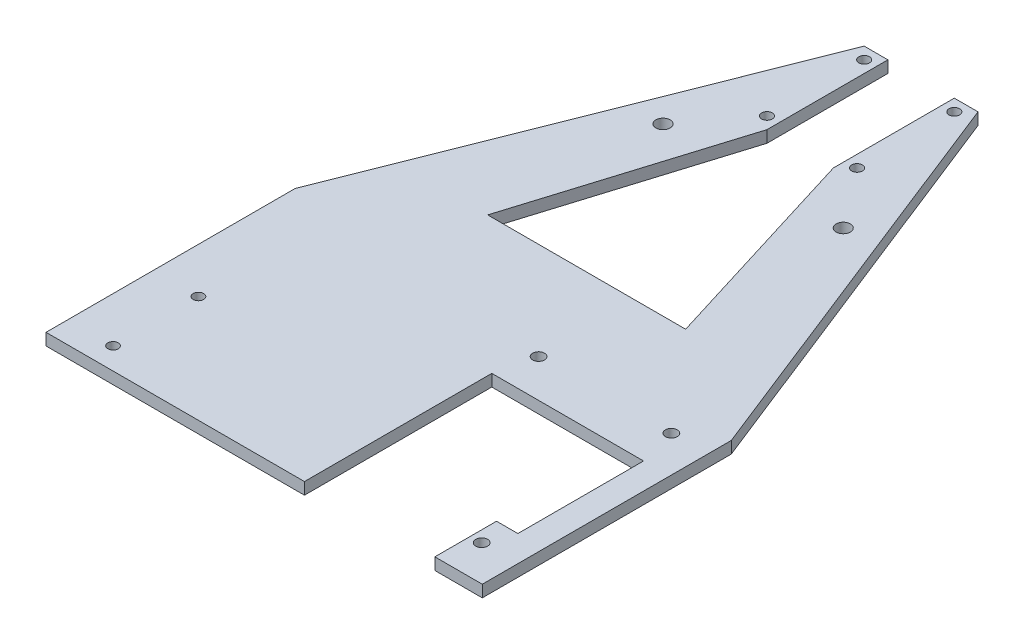
ISO-10303-21;
HEADER;
FILE_DESCRIPTION(('STEP AP214'),'2;1');
FILE_NAME('part.step','',(''),(''),'','','');
FILE_SCHEMA(('AUTOMOTIVE_DESIGN { 1 0 10303 214 1 1 1 1 }'));
ENDSEC;
DATA;
#1=APPLICATION_CONTEXT('core data for automotive mechanical design processes');
#2=APPLICATION_PROTOCOL_DEFINITION('international standard','automotive_design',2000,#1);
#3=PRODUCT_CONTEXT('',#1,'mechanical');
#4=PRODUCT('Part','Part','',(#3));
#5=PRODUCT_RELATED_PRODUCT_CATEGORY('part','',(#4));
#6=PRODUCT_DEFINITION_FORMATION('','',#4);
#7=PRODUCT_DEFINITION_CONTEXT('part definition',#1,'design');
#8=PRODUCT_DEFINITION('design','',#6,#7);
#9=PRODUCT_DEFINITION_SHAPE('','',#8);
#10=(LENGTH_UNIT() NAMED_UNIT(*) SI_UNIT(.MILLI.,.METRE.));
#11=(NAMED_UNIT(*) PLANE_ANGLE_UNIT() SI_UNIT($,.RADIAN.));
#12=(NAMED_UNIT(*) SI_UNIT($,.STERADIAN.) SOLID_ANGLE_UNIT());
#13=UNCERTAINTY_MEASURE_WITH_UNIT(LENGTH_MEASURE(1.E-05),#10,'distance_accuracy_value','');
#14=(GEOMETRIC_REPRESENTATION_CONTEXT(3) GLOBAL_UNCERTAINTY_ASSIGNED_CONTEXT((#13)) GLOBAL_UNIT_ASSIGNED_CONTEXT((#10,
#11,#12)) REPRESENTATION_CONTEXT('',''));
#15=CARTESIAN_POINT('',(0.,0.,0.));
#16=DIRECTION('',(0.,0.,1.));
#17=DIRECTION('',(1.,0.,0.));
#18=AXIS2_PLACEMENT_3D('',#15,#16,#17);
#19=CARTESIAN_POINT('',(0.,5.,0.));
#20=DIRECTION('',(0.,-1.,0.));
#21=DIRECTION('',(0.,0.,-1.));
#22=AXIS2_PLACEMENT_3D('',#19,#20,#21);
#23=PLANE('',#22);
#24=DIRECTION('',(-1.,0.,0.));
#25=VECTOR('',#24,1.);
#26=CARTESIAN_POINT('',(-23.722144460099,5.,-262.395827557433));
#27=LINE('',#26,#25);
#28=CARTESIAN_POINT('',(-13.722144460099,5.,-262.395827557433));
#29=VERTEX_POINT('',#28);
#30=CARTESIAN_POINT('',(-23.722144460099,5.,-262.395827557433));
#31=VERTEX_POINT('',#30);
#32=EDGE_CURVE('E262',#29,#31,#27,.T.);
#33=ORIENTED_EDGE('',*,*,#32,.T.);
#34=DIRECTION('',(-0.367567516948782,0.,0.929996838964578));
#35=VECTOR('',#34,1.);
#36=CARTESIAN_POINT('',(-91.722144460099,5.,-90.346388655563));
#37=LINE('',#36,#35);
#38=CARTESIAN_POINT('',(-91.722144460099,5.,-90.346388655563));
#39=VERTEX_POINT('',#38);
#40=EDGE_CURVE('E132',#31,#39,#37,.T.);
#41=ORIENTED_EDGE('',*,*,#40,.T.);
#42=DIRECTION('',(0.,0.,1.));
#43=VECTOR('',#42,1.);
#44=CARTESIAN_POINT('',(-91.722144460099,5.,4.65356125278762));
#45=LINE('',#44,#43);
#46=CARTESIAN_POINT('',(-91.722144460099,5.,14.6682759918103));
#47=VERTEX_POINT('',#46);
#48=EDGE_CURVE('E323',#39,#47,#45,.T.);
#49=ORIENTED_EDGE('',*,*,#48,.T.);
#50=DIRECTION('',(1.,0.,0.));
#51=VECTOR('',#50,1.);
#52=CARTESIAN_POINT('',(-91.722144460099,5.,14.6682759918103));
#53=LINE('',#52,#51);
#54=CARTESIAN_POINT('',(17.2777981132363,5.,14.6682759918103));
#55=VERTEX_POINT('',#54);
#56=EDGE_CURVE('E343',#47,#55,#53,.T.);
#57=ORIENTED_EDGE('',*,*,#56,.T.);
#58=DIRECTION('',(0.,0.,-1.));
#59=VECTOR('',#58,1.);
#60=CARTESIAN_POINT('',(17.2777981132363,5.,14.6682759918103));
#61=LINE('',#60,#59);
#62=CARTESIAN_POINT('',(17.2777981132363,5.,-64.3464311692135));
#63=VERTEX_POINT('',#62);
#64=EDGE_CURVE('E339',#55,#63,#61,.T.);
#65=ORIENTED_EDGE('',*,*,#64,.T.);
#66=DIRECTION('',(1.,0.,0.));
#67=VECTOR('',#66,1.);
#68=CARTESIAN_POINT('',(81.277855539901,5.,-64.3464311692136));
#69=LINE('',#68,#67);
#70=CARTESIAN_POINT('',(81.277855539901,5.,-64.3464311692136));
#71=VERTEX_POINT('',#70);
#72=EDGE_CURVE('E342',#63,#71,#69,.T.);
#73=ORIENTED_EDGE('',*,*,#72,.T.);
#74=DIRECTION('',(0.,0.,1.));
#75=VECTOR('',#74,1.);
#76=CARTESIAN_POINT('',(81.277855539901,5.,-11.3464311692136));
#77=LINE('',#76,#75);
#78=CARTESIAN_POINT('',(81.277855539901,5.,-11.3464311692136));
#79=VERTEX_POINT('',#78);
#80=EDGE_CURVE('E348',#71,#79,#77,.T.);
#81=ORIENTED_EDGE('',*,*,#80,.T.);
#82=DIRECTION('',(-1.,0.,0.));
#83=VECTOR('',#82,1.);
#84=CARTESIAN_POINT('',(72.277855539901,5.,-11.3464311692136));
#85=LINE('',#84,#83);
#86=CARTESIAN_POINT('',(72.277855539901,5.,-11.3464311692136));
#87=VERTEX_POINT('',#86);
#88=EDGE_CURVE('E355',#79,#87,#85,.T.);
#89=ORIENTED_EDGE('',*,*,#88,.T.);
#90=DIRECTION('',(0.,0.,1.));
#91=VECTOR('',#90,1.);
#92=CARTESIAN_POINT('',(72.277855539901,5.,4.65356125278764));
#93=LINE('',#92,#91);
#94=CARTESIAN_POINT('',(72.277855539901,5.,14.6682759918103));
#95=VERTEX_POINT('',#94);
#96=EDGE_CURVE('E358',#87,#95,#93,.T.);
#97=ORIENTED_EDGE('',*,*,#96,.T.);
#98=DIRECTION('',(1.,0.,0.));
#99=VECTOR('',#98,1.);
#100=CARTESIAN_POINT('',(72.277855539901,5.,14.6682759918103));
#101=LINE('',#100,#99);
#102=CARTESIAN_POINT('',(92.277855539901,5.,14.6682759918103));
#103=VERTEX_POINT('',#102);
#104=EDGE_CURVE('E361',#95,#103,#101,.T.);
#105=ORIENTED_EDGE('',*,*,#104,.T.);
#106=DIRECTION('',(0.,0.,-1.));
#107=VECTOR('',#106,1.);
#108=CARTESIAN_POINT('',(92.277855539901,5.,14.6682759918103));
#109=LINE('',#108,#107);
#110=CARTESIAN_POINT('',(92.277855539901,5.,-90.346388655563));
#111=VERTEX_POINT('',#110);
#112=EDGE_CURVE('E364',#103,#111,#109,.T.);
#113=ORIENTED_EDGE('',*,*,#112,.T.);
#114=DIRECTION('',(-0.367567516948782,0.,-0.929996838964578));
#115=VECTOR('',#114,1.);
#116=CARTESIAN_POINT('',(92.277855539901,5.,-90.346388655563));
#117=LINE('',#116,#115);
#118=CARTESIAN_POINT('',(24.277855539901,5.,-262.395827557433));
#119=VERTEX_POINT('',#118);
#120=EDGE_CURVE('E367',#111,#119,#117,.T.);
#121=ORIENTED_EDGE('',*,*,#120,.T.);
#122=DIRECTION('',(-1.,0.,0.));
#123=VECTOR('',#122,1.);
#124=CARTESIAN_POINT('',(24.277855539901,5.,-262.395827557433));
#125=LINE('',#124,#123);
#126=CARTESIAN_POINT('',(14.277855539901,5.,-262.395827557433));
#127=VERTEX_POINT('',#126);
#128=EDGE_CURVE('E370',#119,#127,#125,.T.);
#129=ORIENTED_EDGE('',*,*,#128,.T.);
#130=DIRECTION('',(0.,0.,1.));
#131=VECTOR('',#130,1.);
#132=CARTESIAN_POINT('',(14.277855539901,5.,-262.395827557433));
#133=LINE('',#132,#131);
#134=CARTESIAN_POINT('',(14.277855539901,5.,-211.395827557433));
#135=VERTEX_POINT('',#134);
#136=EDGE_CURVE('E373',#127,#135,#133,.T.);
#137=ORIENTED_EDGE('',*,*,#136,.T.);
#138=DIRECTION('',(0.29447539626302,0.,0.955659061065052));
#139=VECTOR('',#138,1.);
#140=CARTESIAN_POINT('',(42.0255435318713,5.,-121.346438747212));
#141=LINE('',#140,#139);
#142=CARTESIAN_POINT('',(42.0255435318713,5.,-121.346438747212));
#143=VERTEX_POINT('',#142);
#144=EDGE_CURVE('E181',#135,#143,#141,.T.);
#145=ORIENTED_EDGE('',*,*,#144,.T.);
#146=DIRECTION('',(-1.,0.,0.));
#147=VECTOR('',#146,1.);
#148=CARTESIAN_POINT('',(42.0255435318713,5.,-121.346438747212));
#149=LINE('',#148,#147);
#150=CARTESIAN_POINT('',(-41.4698324520693,5.,-121.346438747212));
#151=VERTEX_POINT('',#150);
#152=EDGE_CURVE('E175',#143,#151,#149,.T.);
#153=ORIENTED_EDGE('',*,*,#152,.T.);
#154=DIRECTION('',(0.29447539626302,0.,-0.955659061065052));
#155=VECTOR('',#154,1.);
#156=CARTESIAN_POINT('',(-41.4698324520693,5.,-121.346438747212));
#157=LINE('',#156,#155);
#158=CARTESIAN_POINT('',(-13.722144460099,5.,-211.395827557433));
#159=VERTEX_POINT('',#158);
#160=EDGE_CURVE('E179',#151,#159,#157,.T.);
#161=ORIENTED_EDGE('',*,*,#160,.T.);
#162=DIRECTION('',(0.,0.,-1.));
#163=VECTOR('',#162,1.);
#164=CARTESIAN_POINT('',(-13.722144460099,5.,-262.395827557433));
#165=LINE('',#164,#163);
#166=EDGE_CURVE('E59',#159,#29,#165,.T.);
#167=ORIENTED_EDGE('',*,*,#166,.T.);
#168=EDGE_LOOP('',(#33,#41,#49,#57,#65,#73,#81,#89,#97,#105,#113,#121,#129,#137,#145,#153,#161,#167));
#169=FACE_BOUND('',#168,.T.);
#170=CARTESIAN_POINT('',(77.0104143684007,5.,-0.346438747212362));
#171=DIRECTION('',(0.,1.,0.));
#172=DIRECTION('',(0.,0.,1.));
#173=AXIS2_PLACEMENT_3D('',#170,#171,#172);
#174=CIRCLE('',#173,2.50000000000001);
#175=CARTESIAN_POINT('',(77.0104143684007,5.,2.15356125278765));
#176=VERTEX_POINT('',#175);
#177=EDGE_CURVE('E209',#176,#176,#174,.T.);
#178=ORIENTED_EDGE('',*,*,#177,.F.);
#179=EDGE_LOOP('',(#178));
#180=FACE_BOUND('',#179,.T.);
#181=CARTESIAN_POINT('',(77.0104143684007,5.,-80.3464387472124));
#182=DIRECTION('',(0.,1.,0.));
#183=DIRECTION('',(0.,0.,1.));
#184=AXIS2_PLACEMENT_3D('',#181,#182,#183);
#185=CIRCLE('',#184,2.50000000000001);
#186=CARTESIAN_POINT('',(77.0104143684007,5.,-77.8464387472124));
#187=VERTEX_POINT('',#186);
#188=EDGE_CURVE('E806',#187,#187,#185,.T.);
#189=ORIENTED_EDGE('',*,*,#188,.F.);
#190=EDGE_LOOP('',(#189));
#191=FACE_BOUND('',#190,.T.);
#192=CARTESIAN_POINT('',(21.0104143684007,5.,-80.3464387472124));
#193=DIRECTION('',(0.,1.,0.));
#194=DIRECTION('',(0.,0.,1.));
#195=AXIS2_PLACEMENT_3D('',#192,#193,#194);
#196=CIRCLE('',#195,2.5);
#197=CARTESIAN_POINT('',(21.0104143684007,5.,-77.8464387472124));
#198=VERTEX_POINT('',#197);
#199=EDGE_CURVE('E814',#198,#198,#196,.T.);
#200=ORIENTED_EDGE('',*,*,#199,.F.);
#201=EDGE_LOOP('',(#200));
#202=FACE_BOUND('',#201,.T.);
#203=CARTESIAN_POINT('',(-72.6567145974466,5.,5.45064864502133));
#204=DIRECTION('',(0.,1.,0.));
#205=DIRECTION('',(0.,0.,1.));
#206=AXIS2_PLACEMENT_3D('',#203,#204,#205);
#207=CIRCLE('',#206,2.2);
#208=CARTESIAN_POINT('',(-72.6567145974466,5.,7.65064864502133));
#209=VERTEX_POINT('',#208);
#210=EDGE_CURVE('E822',#209,#209,#207,.T.);
#211=ORIENTED_EDGE('',*,*,#210,.F.);
#212=EDGE_LOOP('',(#211));
#213=FACE_BOUND('',#212,.T.);
#214=CARTESIAN_POINT('',(-18.722144460099,5.,-257.395827557432));
#215=DIRECTION('',(0.,1.,0.));
#216=DIRECTION('',(0.,0.,1.));
#217=AXIS2_PLACEMENT_3D('',#214,#215,#216);
#218=CIRCLE('',#217,2.25);
#219=CARTESIAN_POINT('',(-18.722144460099,5.,-255.145827557433));
#220=VERTEX_POINT('',#219);
#221=EDGE_CURVE('E830',#220,#220,#218,.T.);
#222=ORIENTED_EDGE('',*,*,#221,.F.);
#223=EDGE_LOOP('',(#222));
#224=FACE_BOUND('',#223,.T.);
#225=CARTESIAN_POINT('',(-18.722144460099,5.,-216.395827557433));
#226=DIRECTION('',(0.,1.,0.));
#227=DIRECTION('',(0.,0.,1.));
#228=AXIS2_PLACEMENT_3D('',#225,#226,#227);
#229=CIRCLE('',#228,2.25);
#230=CARTESIAN_POINT('',(-18.722144460099,5.,-214.145827557433));
#231=VERTEX_POINT('',#230);
#232=EDGE_CURVE('E838',#231,#231,#229,.T.);
#233=ORIENTED_EDGE('',*,*,#232,.F.);
#234=EDGE_LOOP('',(#233));
#235=FACE_BOUND('',#234,.T.);
#236=CARTESIAN_POINT('',(19.277855539901,5.,-257.395827557432));
#237=DIRECTION('',(0.,1.,0.));
#238=DIRECTION('',(0.,0.,1.));
#239=AXIS2_PLACEMENT_3D('',#236,#237,#238);
#240=CIRCLE('',#239,2.25);
#241=CARTESIAN_POINT('',(19.277855539901,5.,-255.145827557433));
#242=VERTEX_POINT('',#241);
#243=EDGE_CURVE('E846',#242,#242,#240,.T.);
#244=ORIENTED_EDGE('',*,*,#243,.F.);
#245=EDGE_LOOP('',(#244));
#246=FACE_BOUND('',#245,.T.);
#247=CARTESIAN_POINT('',(19.277855539901,5.,-216.395827557433));
#248=DIRECTION('',(0.,1.,0.));
#249=DIRECTION('',(0.,0.,1.));
#250=AXIS2_PLACEMENT_3D('',#247,#248,#249);
#251=CIRCLE('',#250,2.25);
#252=CARTESIAN_POINT('',(19.277855539901,5.,-214.145827557433));
#253=VERTEX_POINT('',#252);
#254=EDGE_CURVE('E854',#253,#253,#251,.T.);
#255=ORIENTED_EDGE('',*,*,#254,.F.);
#256=EDGE_LOOP('',(#255));
#257=FACE_BOUND('',#256,.T.);
#258=CARTESIAN_POINT('',(-37.722144460099,5.,-191.55194095078));
#259=DIRECTION('',(0.,1.,0.));
#260=DIRECTION('',(0.,0.,1.));
#261=AXIS2_PLACEMENT_3D('',#258,#259,#260);
#262=CIRCLE('',#261,3.);
#263=CARTESIAN_POINT('',(-37.722144460099,5.,-188.55194095078));
#264=VERTEX_POINT('',#263);
#265=EDGE_CURVE('E862',#264,#264,#262,.T.);
#266=ORIENTED_EDGE('',*,*,#265,.F.);
#267=EDGE_LOOP('',(#266));
#268=FACE_BOUND('',#267,.T.);
#269=CARTESIAN_POINT('',(38.277855539901,5.,-191.55194095078));
#270=DIRECTION('',(0.,1.,0.));
#271=DIRECTION('',(0.,0.,1.));
#272=AXIS2_PLACEMENT_3D('',#269,#270,#271);
#273=CIRCLE('',#272,3.);
#274=CARTESIAN_POINT('',(38.277855539901,5.,-188.55194095078));
#275=VERTEX_POINT('',#274);
#276=EDGE_CURVE('E870',#275,#275,#273,.T.);
#277=ORIENTED_EDGE('',*,*,#276,.F.);
#278=EDGE_LOOP('',(#277));
#279=FACE_BOUND('',#278,.T.);
#280=CARTESIAN_POINT('',(-72.6567145974466,5.,-30.5493513549787));
#281=DIRECTION('',(0.,1.,0.));
#282=DIRECTION('',(0.,0.,1.));
#283=AXIS2_PLACEMENT_3D('',#280,#281,#282);
#284=CIRCLE('',#283,2.2);
#285=CARTESIAN_POINT('',(-72.6567145974466,5.,-28.3493513549787));
#286=VERTEX_POINT('',#285);
#287=EDGE_CURVE('E878',#286,#286,#284,.T.);
#288=ORIENTED_EDGE('',*,*,#287,.F.);
#289=EDGE_LOOP('',(#288));
#290=FACE_BOUND('',#289,.T.);
#291=ADVANCED_FACE('F41',(#169,#180,#191,#202,#213,#224,#235,#246,#257,#268,#279,#290),#23,.F.);
#292=CARTESIAN_POINT('',(0.,0.,0.));
#293=DIRECTION('',(0.,-1.,0.));
#294=DIRECTION('',(0.,0.,-1.));
#295=AXIS2_PLACEMENT_3D('',#292,#293,#294);
#296=PLANE('',#295);
#297=CARTESIAN_POINT('',(38.277855539901,0.,-191.55194095078));
#298=DIRECTION('',(0.,1.,0.));
#299=DIRECTION('',(0.,0.,1.));
#300=AXIS2_PLACEMENT_3D('',#297,#298,#299);
#301=CIRCLE('',#300,3.);
#302=CARTESIAN_POINT('',(38.277855539901,0.,-188.55194095078));
#303=VERTEX_POINT('',#302);
#304=EDGE_CURVE('E874',#303,#303,#301,.T.);
#305=ORIENTED_EDGE('',*,*,#304,.T.);
#306=EDGE_LOOP('',(#305));
#307=FACE_BOUND('',#306,.T.);
#308=CARTESIAN_POINT('',(19.277855539901,0.,-216.395827557433));
#309=DIRECTION('',(0.,1.,0.));
#310=DIRECTION('',(0.,0.,1.));
#311=AXIS2_PLACEMENT_3D('',#308,#309,#310);
#312=CIRCLE('',#311,2.25);
#313=CARTESIAN_POINT('',(19.277855539901,0.,-214.145827557433));
#314=VERTEX_POINT('',#313);
#315=EDGE_CURVE('E858',#314,#314,#312,.T.);
#316=ORIENTED_EDGE('',*,*,#315,.T.);
#317=EDGE_LOOP('',(#316));
#318=FACE_BOUND('',#317,.T.);
#319=CARTESIAN_POINT('',(-18.722144460099,0.,-216.395827557433));
#320=DIRECTION('',(0.,1.,0.));
#321=DIRECTION('',(0.,0.,1.));
#322=AXIS2_PLACEMENT_3D('',#319,#320,#321);
#323=CIRCLE('',#322,2.25);
#324=CARTESIAN_POINT('',(-18.722144460099,0.,-214.145827557433));
#325=VERTEX_POINT('',#324);
#326=EDGE_CURVE('E842',#325,#325,#323,.T.);
#327=ORIENTED_EDGE('',*,*,#326,.T.);
#328=EDGE_LOOP('',(#327));
#329=FACE_BOUND('',#328,.T.);
#330=CARTESIAN_POINT('',(-72.6567145974466,0.,5.45064864502133));
#331=DIRECTION('',(0.,1.,0.));
#332=DIRECTION('',(0.,0.,1.));
#333=AXIS2_PLACEMENT_3D('',#330,#331,#332);
#334=CIRCLE('',#333,2.2);
#335=CARTESIAN_POINT('',(-72.6567145974466,0.,7.65064864502133));
#336=VERTEX_POINT('',#335);
#337=EDGE_CURVE('E826',#336,#336,#334,.T.);
#338=ORIENTED_EDGE('',*,*,#337,.T.);
#339=EDGE_LOOP('',(#338));
#340=FACE_BOUND('',#339,.T.);
#341=CARTESIAN_POINT('',(77.0104143684007,0.,-80.3464387472124));
#342=DIRECTION('',(0.,1.,0.));
#343=DIRECTION('',(0.,0.,1.));
#344=AXIS2_PLACEMENT_3D('',#341,#342,#343);
#345=CIRCLE('',#344,2.50000000000001);
#346=CARTESIAN_POINT('',(77.0104143684007,0.,-77.8464387472124));
#347=VERTEX_POINT('',#346);
#348=EDGE_CURVE('E810',#347,#347,#345,.T.);
#349=ORIENTED_EDGE('',*,*,#348,.T.);
#350=EDGE_LOOP('',(#349));
#351=FACE_BOUND('',#350,.T.);
#352=DIRECTION('',(-1.,0.,0.));
#353=VECTOR('',#352,1.);
#354=CARTESIAN_POINT('',(-23.722144460099,0.,-262.395827557433));
#355=LINE('',#354,#353);
#356=CARTESIAN_POINT('',(-13.722144460099,0.,-262.395827557433));
#357=VERTEX_POINT('',#356);
#358=CARTESIAN_POINT('',(-23.722144460099,0.,-262.395827557433));
#359=VERTEX_POINT('',#358);
#360=EDGE_CURVE('E204',#357,#359,#355,.T.);
#361=ORIENTED_EDGE('',*,*,#360,.F.);
#362=DIRECTION('',(0.,0.,-1.));
#363=VECTOR('',#362,1.);
#364=CARTESIAN_POINT('',(-13.722144460099,0.,-262.395827557433));
#365=LINE('',#364,#363);
#366=CARTESIAN_POINT('',(-13.722144460099,0.,-211.395827557433));
#367=VERTEX_POINT('',#366);
#368=EDGE_CURVE('E124',#367,#357,#365,.T.);
#369=ORIENTED_EDGE('',*,*,#368,.F.);
#370=DIRECTION('',(0.29447539626302,0.,-0.955659061065052));
#371=VECTOR('',#370,1.);
#372=CARTESIAN_POINT('',(-41.4698324520693,0.,-121.346438747212));
#373=LINE('',#372,#371);
#374=CARTESIAN_POINT('',(-41.4698324520693,0.,-121.346438747212));
#375=VERTEX_POINT('',#374);
#376=EDGE_CURVE('E118',#375,#367,#373,.T.);
#377=ORIENTED_EDGE('',*,*,#376,.F.);
#378=DIRECTION('',(-1.,0.,0.));
#379=VECTOR('',#378,1.);
#380=CARTESIAN_POINT('',(42.0255435318713,0.,-121.346438747212));
#381=LINE('',#380,#379);
#382=CARTESIAN_POINT('',(42.0255435318713,0.,-121.346438747212));
#383=VERTEX_POINT('',#382);
#384=EDGE_CURVE('E190',#383,#375,#381,.T.);
#385=ORIENTED_EDGE('',*,*,#384,.F.);
#386=DIRECTION('',(0.29447539626302,0.,0.955659061065052));
#387=VECTOR('',#386,1.);
#388=CARTESIAN_POINT('',(42.0255435318713,0.,-121.346438747212));
#389=LINE('',#388,#387);
#390=CARTESIAN_POINT('',(14.277855539901,0.,-211.395827557433));
#391=VERTEX_POINT('',#390);
#392=EDGE_CURVE('E253',#391,#383,#389,.T.);
#393=ORIENTED_EDGE('',*,*,#392,.F.);
#394=DIRECTION('',(0.,0.,1.));
#395=VECTOR('',#394,1.);
#396=CARTESIAN_POINT('',(14.277855539901,0.,-262.395827557433));
#397=LINE('',#396,#395);
#398=CARTESIAN_POINT('',(14.277855539901,0.,-262.395827557433));
#399=VERTEX_POINT('',#398);
#400=EDGE_CURVE('E250',#399,#391,#397,.T.);
#401=ORIENTED_EDGE('',*,*,#400,.F.);
#402=DIRECTION('',(-1.,0.,0.));
#403=VECTOR('',#402,1.);
#404=CARTESIAN_POINT('',(24.277855539901,0.,-262.395827557433));
#405=LINE('',#404,#403);
#406=CARTESIAN_POINT('',(24.277855539901,0.,-262.395827557433));
#407=VERTEX_POINT('',#406);
#408=EDGE_CURVE('E247',#407,#399,#405,.T.);
#409=ORIENTED_EDGE('',*,*,#408,.F.);
#410=DIRECTION('',(-0.367567516948782,0.,-0.929996838964578));
#411=VECTOR('',#410,1.);
#412=CARTESIAN_POINT('',(92.277855539901,0.,-90.346388655563));
#413=LINE('',#412,#411);
#414=CARTESIAN_POINT('',(92.277855539901,0.,-90.346388655563));
#415=VERTEX_POINT('',#414);
#416=EDGE_CURVE('E244',#415,#407,#413,.T.);
#417=ORIENTED_EDGE('',*,*,#416,.F.);
#418=DIRECTION('',(0.,0.,-1.));
#419=VECTOR('',#418,1.);
#420=CARTESIAN_POINT('',(92.277855539901,0.,4.65356125278764));
#421=LINE('',#420,#419);
#422=CARTESIAN_POINT('',(92.277855539901,0.,14.6682759918103));
#423=VERTEX_POINT('',#422);
#424=EDGE_CURVE('E241',#423,#415,#421,.T.);
#425=ORIENTED_EDGE('',*,*,#424,.F.);
#426=DIRECTION('',(1.,0.,0.));
#427=VECTOR('',#426,1.);
#428=CARTESIAN_POINT('',(72.277855539901,0.,14.6682759918103));
#429=LINE('',#428,#427);
#430=CARTESIAN_POINT('',(72.277855539901,0.,14.6682759918103));
#431=VERTEX_POINT('',#430);
#432=EDGE_CURVE('E237',#431,#423,#429,.T.);
#433=ORIENTED_EDGE('',*,*,#432,.F.);
#434=DIRECTION('',(0.,0.,1.));
#435=VECTOR('',#434,1.);
#436=CARTESIAN_POINT('',(72.277855539901,0.,10.4335612527876));
#437=LINE('',#436,#435);
#438=CARTESIAN_POINT('',(72.277855539901,0.,-11.3464311692136));
#439=VERTEX_POINT('',#438);
#440=EDGE_CURVE('E234',#439,#431,#437,.T.);
#441=ORIENTED_EDGE('',*,*,#440,.F.);
#442=DIRECTION('',(-1.,0.,0.));
#443=VECTOR('',#442,1.);
#444=CARTESIAN_POINT('',(72.277855539901,0.,-11.3464311692136));
#445=LINE('',#444,#443);
#446=CARTESIAN_POINT('',(81.277855539901,0.,-11.3464311692136));
#447=VERTEX_POINT('',#446);
#448=EDGE_CURVE('E230',#447,#439,#445,.T.);
#449=ORIENTED_EDGE('',*,*,#448,.F.);
#450=DIRECTION('',(0.,0.,1.));
#451=VECTOR('',#450,1.);
#452=CARTESIAN_POINT('',(81.277855539901,0.,-11.3464311692136));
#453=LINE('',#452,#451);
#454=CARTESIAN_POINT('',(81.277855539901,0.,-64.3464311692136));
#455=VERTEX_POINT('',#454);
#456=EDGE_CURVE('E227',#455,#447,#453,.T.);
#457=ORIENTED_EDGE('',*,*,#456,.F.);
#458=DIRECTION('',(1.,0.,0.));
#459=VECTOR('',#458,1.);
#460=CARTESIAN_POINT('',(81.277855539901,0.,-64.3464311692136));
#461=LINE('',#460,#459);
#462=CARTESIAN_POINT('',(17.2777981132363,0.,-64.3464311692135));
#463=VERTEX_POINT('',#462);
#464=EDGE_CURVE('E224',#463,#455,#461,.T.);
#465=ORIENTED_EDGE('',*,*,#464,.F.);
#466=DIRECTION('',(0.,0.,-1.));
#467=VECTOR('',#466,1.);
#468=CARTESIAN_POINT('',(17.2777981132363,0.,-64.3464311692135));
#469=LINE('',#468,#467);
#470=CARTESIAN_POINT('',(17.2777981132363,0.,14.6682759918103));
#471=VERTEX_POINT('',#470);
#472=EDGE_CURVE('E221',#471,#463,#469,.T.);
#473=ORIENTED_EDGE('',*,*,#472,.F.);
#474=DIRECTION('',(1.,0.,0.));
#475=VECTOR('',#474,1.);
#476=CARTESIAN_POINT('',(-91.4567145974466,0.,14.6682759918103));
#477=LINE('',#476,#475);
#478=CARTESIAN_POINT('',(-91.722144460099,0.,14.6682759918103));
#479=VERTEX_POINT('',#478);
#480=EDGE_CURVE('E217',#479,#471,#477,.T.);
#481=ORIENTED_EDGE('',*,*,#480,.F.);
#482=DIRECTION('',(0.,0.,1.));
#483=VECTOR('',#482,1.);
#484=CARTESIAN_POINT('',(-91.722144460099,0.,10.4335612527876));
#485=LINE('',#484,#483);
#486=CARTESIAN_POINT('',(-91.722144460099,0.,-90.346388655563));
#487=VERTEX_POINT('',#486);
#488=EDGE_CURVE('E213',#487,#479,#485,.T.);
#489=ORIENTED_EDGE('',*,*,#488,.F.);
#490=DIRECTION('',(-0.367567516948782,0.,0.929996838964578));
#491=VECTOR('',#490,1.);
#492=CARTESIAN_POINT('',(-91.722144460099,0.,-90.346388655563));
#493=LINE('',#492,#491);
#494=EDGE_CURVE('E208',#359,#487,#493,.T.);
#495=ORIENTED_EDGE('',*,*,#494,.F.);
#496=EDGE_LOOP('',(#361,#369,#377,#385,#393,#401,#409,#417,#425,#433,#441,#449,#457,#465,#473,
#481,#489,#495));
#497=FACE_BOUND('',#496,.T.);
#498=CARTESIAN_POINT('',(77.0104143684007,0.,-0.346438747212362));
#499=DIRECTION('',(0.,1.,0.));
#500=DIRECTION('',(0.,0.,1.));
#501=AXIS2_PLACEMENT_3D('',#498,#499,#500);
#502=CIRCLE('',#501,2.50000000000001);
#503=CARTESIAN_POINT('',(77.0104143684007,0.,2.15356125278765));
#504=VERTEX_POINT('',#503);
#505=EDGE_CURVE('E798',#504,#504,#502,.T.);
#506=ORIENTED_EDGE('',*,*,#505,.T.);
#507=EDGE_LOOP('',(#506));
#508=FACE_BOUND('',#507,.T.);
#509=CARTESIAN_POINT('',(21.0104143684007,0.,-80.3464387472124));
#510=DIRECTION('',(0.,1.,0.));
#511=DIRECTION('',(0.,0.,1.));
#512=AXIS2_PLACEMENT_3D('',#509,#510,#511);
#513=CIRCLE('',#512,2.5);
#514=CARTESIAN_POINT('',(21.0104143684007,0.,-77.8464387472124));
#515=VERTEX_POINT('',#514);
#516=EDGE_CURVE('E818',#515,#515,#513,.T.);
#517=ORIENTED_EDGE('',*,*,#516,.T.);
#518=EDGE_LOOP('',(#517));
#519=FACE_BOUND('',#518,.T.);
#520=CARTESIAN_POINT('',(-18.722144460099,0.,-257.395827557432));
#521=DIRECTION('',(0.,1.,0.));
#522=DIRECTION('',(0.,0.,1.));
#523=AXIS2_PLACEMENT_3D('',#520,#521,#522);
#524=CIRCLE('',#523,2.25);
#525=CARTESIAN_POINT('',(-18.722144460099,0.,-255.145827557433));
#526=VERTEX_POINT('',#525);
#527=EDGE_CURVE('E834',#526,#526,#524,.T.);
#528=ORIENTED_EDGE('',*,*,#527,.T.);
#529=EDGE_LOOP('',(#528));
#530=FACE_BOUND('',#529,.T.);
#531=CARTESIAN_POINT('',(19.277855539901,0.,-257.395827557432));
#532=DIRECTION('',(0.,1.,0.));
#533=DIRECTION('',(0.,0.,1.));
#534=AXIS2_PLACEMENT_3D('',#531,#532,#533);
#535=CIRCLE('',#534,2.25);
#536=CARTESIAN_POINT('',(19.277855539901,0.,-255.145827557433));
#537=VERTEX_POINT('',#536);
#538=EDGE_CURVE('E850',#537,#537,#535,.T.);
#539=ORIENTED_EDGE('',*,*,#538,.T.);
#540=EDGE_LOOP('',(#539));
#541=FACE_BOUND('',#540,.T.);
#542=CARTESIAN_POINT('',(-37.722144460099,0.,-191.55194095078));
#543=DIRECTION('',(0.,1.,0.));
#544=DIRECTION('',(0.,0.,1.));
#545=AXIS2_PLACEMENT_3D('',#542,#543,#544);
#546=CIRCLE('',#545,3.);
#547=CARTESIAN_POINT('',(-37.722144460099,0.,-188.55194095078));
#548=VERTEX_POINT('',#547);
#549=EDGE_CURVE('E866',#548,#548,#546,.T.);
#550=ORIENTED_EDGE('',*,*,#549,.T.);
#551=EDGE_LOOP('',(#550));
#552=FACE_BOUND('',#551,.T.);
#553=CARTESIAN_POINT('',(-72.6567145974466,0.,-30.5493513549787));
#554=DIRECTION('',(0.,1.,0.));
#555=DIRECTION('',(0.,0.,1.));
#556=AXIS2_PLACEMENT_3D('',#553,#554,#555);
#557=CIRCLE('',#556,2.2);
#558=CARTESIAN_POINT('',(-72.6567145974466,0.,-28.3493513549787));
#559=VERTEX_POINT('',#558);
#560=EDGE_CURVE('E882',#559,#559,#557,.T.);
#561=ORIENTED_EDGE('',*,*,#560,.T.);
#562=EDGE_LOOP('',(#561));
#563=FACE_BOUND('',#562,.T.);
#564=ADVANCED_FACE('F328',(#307,#318,#329,#340,#351,#497,#508,#519,#530,#541,#552,#563),#296,.T.);
#565=CARTESIAN_POINT('',(-23.722144460099,5.,-262.395827557433));
#566=DIRECTION('',(0.,0.,1.));
#567=DIRECTION('',(1.,0.,0.));
#568=AXIS2_PLACEMENT_3D('',#565,#566,#567);
#569=PLANE('',#568);
#570=ORIENTED_EDGE('',*,*,#360,.T.);
#571=DIRECTION('',(0.,-1.,0.));
#572=VECTOR('',#571,1.);
#573=CARTESIAN_POINT('',(-23.722144460099,5.,-262.395827557433));
#574=LINE('',#573,#572);
#575=EDGE_CURVE('E11',#31,#359,#574,.T.);
#576=ORIENTED_EDGE('',*,*,#575,.F.);
#577=ORIENTED_EDGE('',*,*,#32,.F.);
#578=DIRECTION('',(0.,-1.,0.));
#579=VECTOR('',#578,1.);
#580=CARTESIAN_POINT('',(-13.722144460099,5.,-262.395827557433));
#581=LINE('',#580,#579);
#582=EDGE_CURVE('E200',#29,#357,#581,.T.);
#583=ORIENTED_EDGE('',*,*,#582,.T.);
#584=EDGE_LOOP('',(#570,#576,#577,#583));
#585=FACE_BOUND('',#584,.T.);
#586=ADVANCED_FACE('F43',(#585),#569,.F.);
#587=CARTESIAN_POINT('',(-91.722144460099,5.,-90.346388655563));
#588=DIRECTION('',(0.929996838964578,0.,0.367567516948782));
#589=DIRECTION('',(0.367567516948782,0.,-0.929996838964578));
#590=AXIS2_PLACEMENT_3D('',#587,#588,#589);
#591=PLANE('',#590);
#592=ORIENTED_EDGE('',*,*,#494,.T.);
#593=DIRECTION('',(0.,-1.,0.));
#594=VECTOR('',#593,1.);
#595=CARTESIAN_POINT('',(-91.722144460099,5.,-90.346388655563));
#596=LINE('',#595,#594);
#597=EDGE_CURVE('E51',#39,#487,#596,.T.);
#598=ORIENTED_EDGE('',*,*,#597,.F.);
#599=ORIENTED_EDGE('',*,*,#40,.F.);
#600=ORIENTED_EDGE('',*,*,#575,.T.);
#601=EDGE_LOOP('',(#592,#598,#599,#600));
#602=FACE_BOUND('',#601,.T.);
#603=ADVANCED_FACE('F324',(#602),#591,.F.);
#604=CARTESIAN_POINT('',(-91.722144460099,5.,10.4335612527876));
#605=DIRECTION('',(1.,0.,0.));
#606=DIRECTION('',(0.,0.,-1.));
#607=AXIS2_PLACEMENT_3D('',#604,#605,#606);
#608=PLANE('',#607);
#609=ORIENTED_EDGE('',*,*,#488,.T.);
#610=DIRECTION('',(0.,-1.,0.));
#611=VECTOR('',#610,1.);
#612=CARTESIAN_POINT('',(-91.722144460099,5.,14.6682759918103));
#613=LINE('',#612,#611);
#614=EDGE_CURVE('E313',#47,#479,#613,.T.);
#615=ORIENTED_EDGE('',*,*,#614,.F.);
#616=ORIENTED_EDGE('',*,*,#48,.F.);
#617=ORIENTED_EDGE('',*,*,#597,.T.);
#618=EDGE_LOOP('',(#609,#615,#616,#617));
#619=FACE_BOUND('',#618,.T.);
#620=ADVANCED_FACE('F321',(#619),#608,.F.);
#621=CARTESIAN_POINT('',(-91.4567145974466,5.,14.6682759918103));
#622=DIRECTION('',(0.,0.,-1.));
#623=DIRECTION('',(-1.,0.,0.));
#624=AXIS2_PLACEMENT_3D('',#621,#622,#623);
#625=PLANE('',#624);
#626=ORIENTED_EDGE('',*,*,#480,.T.);
#627=DIRECTION('',(0.,-1.,0.));
#628=VECTOR('',#627,1.);
#629=CARTESIAN_POINT('',(17.2777981132363,5.,14.6682759918103));
#630=LINE('',#629,#628);
#631=EDGE_CURVE('E309',#55,#471,#630,.T.);
#632=ORIENTED_EDGE('',*,*,#631,.F.);
#633=ORIENTED_EDGE('',*,*,#56,.F.);
#634=ORIENTED_EDGE('',*,*,#614,.T.);
#635=EDGE_LOOP('',(#626,#632,#633,#634));
#636=FACE_BOUND('',#635,.T.);
#637=ADVANCED_FACE('F333',(#636),#625,.F.);
#638=CARTESIAN_POINT('',(17.2777981132363,5.,-64.3464311692135));
#639=DIRECTION('',(-1.,0.,0.));
#640=DIRECTION('',(0.,0.,1.));
#641=AXIS2_PLACEMENT_3D('',#638,#639,#640);
#642=PLANE('',#641);
#643=ORIENTED_EDGE('',*,*,#472,.T.);
#644=DIRECTION('',(0.,-1.,0.));
#645=VECTOR('',#644,1.);
#646=CARTESIAN_POINT('',(17.2777981132363,5.,-64.3464311692135));
#647=LINE('',#646,#645);
#648=EDGE_CURVE('E305',#63,#463,#647,.T.);
#649=ORIENTED_EDGE('',*,*,#648,.F.);
#650=ORIENTED_EDGE('',*,*,#64,.F.);
#651=ORIENTED_EDGE('',*,*,#631,.T.);
#652=EDGE_LOOP('',(#643,#649,#650,#651));
#653=FACE_BOUND('',#652,.T.);
#654=ADVANCED_FACE('F337',(#653),#642,.F.);
#655=CARTESIAN_POINT('',(81.277855539901,5.,-64.3464311692136));
#656=DIRECTION('',(0.,0.,-1.));
#657=DIRECTION('',(-1.,0.,0.));
#658=AXIS2_PLACEMENT_3D('',#655,#656,#657);
#659=PLANE('',#658);
#660=ORIENTED_EDGE('',*,*,#464,.T.);
#661=DIRECTION('',(0.,-1.,0.));
#662=VECTOR('',#661,1.);
#663=CARTESIAN_POINT('',(81.277855539901,5.,-64.3464311692136));
#664=LINE('',#663,#662);
#665=EDGE_CURVE('E301',#71,#455,#664,.T.);
#666=ORIENTED_EDGE('',*,*,#665,.F.);
#667=ORIENTED_EDGE('',*,*,#72,.F.);
#668=ORIENTED_EDGE('',*,*,#648,.T.);
#669=EDGE_LOOP('',(#660,#666,#667,#668));
#670=FACE_BOUND('',#669,.T.);
#671=ADVANCED_FACE('F430',(#670),#659,.F.);
#672=CARTESIAN_POINT('',(81.277855539901,5.,-11.3464311692136));
#673=DIRECTION('',(1.,0.,0.));
#674=DIRECTION('',(0.,0.,-1.));
#675=AXIS2_PLACEMENT_3D('',#672,#673,#674);
#676=PLANE('',#675);
#677=ORIENTED_EDGE('',*,*,#456,.T.);
#678=DIRECTION('',(0.,-1.,0.));
#679=VECTOR('',#678,1.);
#680=CARTESIAN_POINT('',(81.277855539901,5.,-11.3464311692136));
#681=LINE('',#680,#679);
#682=EDGE_CURVE('E297',#79,#447,#681,.T.);
#683=ORIENTED_EDGE('',*,*,#682,.F.);
#684=ORIENTED_EDGE('',*,*,#80,.F.);
#685=ORIENTED_EDGE('',*,*,#665,.T.);
#686=EDGE_LOOP('',(#677,#683,#684,#685));
#687=FACE_BOUND('',#686,.T.);
#688=ADVANCED_FACE('F427',(#687),#676,.F.);
#689=CARTESIAN_POINT('',(72.277855539901,5.,-11.3464311692136));
#690=DIRECTION('',(0.,0.,1.));
#691=DIRECTION('',(1.,0.,0.));
#692=AXIS2_PLACEMENT_3D('',#689,#690,#691);
#693=PLANE('',#692);
#694=ORIENTED_EDGE('',*,*,#448,.T.);
#695=DIRECTION('',(0.,-1.,0.));
#696=VECTOR('',#695,1.);
#697=CARTESIAN_POINT('',(72.277855539901,5.,-11.3464311692136));
#698=LINE('',#697,#696);
#699=EDGE_CURVE('E293',#87,#439,#698,.T.);
#700=ORIENTED_EDGE('',*,*,#699,.F.);
#701=ORIENTED_EDGE('',*,*,#88,.F.);
#702=ORIENTED_EDGE('',*,*,#682,.T.);
#703=EDGE_LOOP('',(#694,#700,#701,#702));
#704=FACE_BOUND('',#703,.T.);
#705=ADVANCED_FACE('F422',(#704),#693,.F.);
#706=CARTESIAN_POINT('',(72.277855539901,5.,10.4335612527876));
#707=DIRECTION('',(1.,0.,0.));
#708=DIRECTION('',(0.,0.,-1.));
#709=AXIS2_PLACEMENT_3D('',#706,#707,#708);
#710=PLANE('',#709);
#711=ORIENTED_EDGE('',*,*,#440,.T.);
#712=DIRECTION('',(0.,-1.,0.));
#713=VECTOR('',#712,1.);
#714=CARTESIAN_POINT('',(72.277855539901,5.,14.6682759918103));
#715=LINE('',#714,#713);
#716=EDGE_CURVE('E289',#95,#431,#715,.T.);
#717=ORIENTED_EDGE('',*,*,#716,.F.);
#718=ORIENTED_EDGE('',*,*,#96,.F.);
#719=ORIENTED_EDGE('',*,*,#699,.T.);
#720=EDGE_LOOP('',(#711,#717,#718,#719));
#721=FACE_BOUND('',#720,.T.);
#722=ADVANCED_FACE('F417',(#721),#710,.F.);
#723=CARTESIAN_POINT('',(72.277855539901,5.,14.6682759918103));
#724=DIRECTION('',(0.,0.,-1.));
#725=DIRECTION('',(-1.,0.,0.));
#726=AXIS2_PLACEMENT_3D('',#723,#724,#725);
#727=PLANE('',#726);
#728=ORIENTED_EDGE('',*,*,#432,.T.);
#729=DIRECTION('',(0.,-1.,0.));
#730=VECTOR('',#729,1.);
#731=CARTESIAN_POINT('',(92.277855539901,5.,14.6682759918103));
#732=LINE('',#731,#730);
#733=EDGE_CURVE('E285',#103,#423,#732,.T.);
#734=ORIENTED_EDGE('',*,*,#733,.F.);
#735=ORIENTED_EDGE('',*,*,#104,.F.);
#736=ORIENTED_EDGE('',*,*,#716,.T.);
#737=EDGE_LOOP('',(#728,#734,#735,#736));
#738=FACE_BOUND('',#737,.T.);
#739=ADVANCED_FACE('F412',(#738),#727,.F.);
#740=CARTESIAN_POINT('',(92.277855539901,5.,4.65356125278764));
#741=DIRECTION('',(-1.,0.,0.));
#742=DIRECTION('',(0.,0.,1.));
#743=AXIS2_PLACEMENT_3D('',#740,#741,#742);
#744=PLANE('',#743);
#745=ORIENTED_EDGE('',*,*,#424,.T.);
#746=DIRECTION('',(0.,-1.,0.));
#747=VECTOR('',#746,1.);
#748=CARTESIAN_POINT('',(92.277855539901,5.,-90.346388655563));
#749=LINE('',#748,#747);
#750=EDGE_CURVE('E281',#111,#415,#749,.T.);
#751=ORIENTED_EDGE('',*,*,#750,.F.);
#752=ORIENTED_EDGE('',*,*,#112,.F.);
#753=ORIENTED_EDGE('',*,*,#733,.T.);
#754=EDGE_LOOP('',(#745,#751,#752,#753));
#755=FACE_BOUND('',#754,.T.);
#756=ADVANCED_FACE('F408',(#755),#744,.F.);
#757=CARTESIAN_POINT('',(92.277855539901,5.,-90.346388655563));
#758=DIRECTION('',(-0.929996838964578,0.,0.367567516948782));
#759=DIRECTION('',(0.367567516948782,0.,0.929996838964578));
#760=AXIS2_PLACEMENT_3D('',#757,#758,#759);
#761=PLANE('',#760);
#762=ORIENTED_EDGE('',*,*,#416,.T.);
#763=DIRECTION('',(0.,-1.,0.));
#764=VECTOR('',#763,1.);
#765=CARTESIAN_POINT('',(24.277855539901,5.,-262.395827557433));
#766=LINE('',#765,#764);
#767=EDGE_CURVE('E277',#119,#407,#766,.T.);
#768=ORIENTED_EDGE('',*,*,#767,.F.);
#769=ORIENTED_EDGE('',*,*,#120,.F.);
#770=ORIENTED_EDGE('',*,*,#750,.T.);
#771=EDGE_LOOP('',(#762,#768,#769,#770));
#772=FACE_BOUND('',#771,.T.);
#773=ADVANCED_FACE('F404',(#772),#761,.F.);
#774=CARTESIAN_POINT('',(24.277855539901,5.,-262.395827557433));
#775=DIRECTION('',(0.,0.,1.));
#776=DIRECTION('',(1.,0.,0.));
#777=AXIS2_PLACEMENT_3D('',#774,#775,#776);
#778=PLANE('',#777);
#779=ORIENTED_EDGE('',*,*,#408,.T.);
#780=DIRECTION('',(0.,-1.,0.));
#781=VECTOR('',#780,1.);
#782=CARTESIAN_POINT('',(14.277855539901,5.,-262.395827557433));
#783=LINE('',#782,#781);
#784=EDGE_CURVE('E273',#127,#399,#783,.T.);
#785=ORIENTED_EDGE('',*,*,#784,.F.);
#786=ORIENTED_EDGE('',*,*,#128,.F.);
#787=ORIENTED_EDGE('',*,*,#767,.T.);
#788=EDGE_LOOP('',(#779,#785,#786,#787));
#789=FACE_BOUND('',#788,.T.);
#790=ADVANCED_FACE('F400',(#789),#778,.F.);
#791=CARTESIAN_POINT('',(14.277855539901,5.,-262.395827557433));
#792=DIRECTION('',(1.,0.,0.));
#793=DIRECTION('',(0.,0.,-1.));
#794=AXIS2_PLACEMENT_3D('',#791,#792,#793);
#795=PLANE('',#794);
#796=ORIENTED_EDGE('',*,*,#400,.T.);
#797=DIRECTION('',(0.,-1.,0.));
#798=VECTOR('',#797,1.);
#799=CARTESIAN_POINT('',(14.277855539901,5.,-211.395827557433));
#800=LINE('',#799,#798);
#801=EDGE_CURVE('E269',#135,#391,#800,.T.);
#802=ORIENTED_EDGE('',*,*,#801,.F.);
#803=ORIENTED_EDGE('',*,*,#136,.F.);
#804=ORIENTED_EDGE('',*,*,#784,.T.);
#805=EDGE_LOOP('',(#796,#802,#803,#804));
#806=FACE_BOUND('',#805,.T.);
#807=ADVANCED_FACE('F392',(#806),#795,.F.);
#808=CARTESIAN_POINT('',(42.0255435318713,5.,-121.346438747212));
#809=DIRECTION('',(0.955659061065052,0.,-0.29447539626302));
#810=DIRECTION('',(-0.29447539626302,0.,-0.955659061065052));
#811=AXIS2_PLACEMENT_3D('',#808,#809,#810);
#812=PLANE('',#811);
#813=ORIENTED_EDGE('',*,*,#392,.T.);
#814=DIRECTION('',(0.,-1.,0.));
#815=VECTOR('',#814,1.);
#816=CARTESIAN_POINT('',(42.0255435318713,5.,-121.346438747212));
#817=LINE('',#816,#815);
#818=EDGE_CURVE('E192',#143,#383,#817,.T.);
#819=ORIENTED_EDGE('',*,*,#818,.F.);
#820=ORIENTED_EDGE('',*,*,#144,.F.);
#821=ORIENTED_EDGE('',*,*,#801,.T.);
#822=EDGE_LOOP('',(#813,#819,#820,#821));
#823=FACE_BOUND('',#822,.T.);
#824=ADVANCED_FACE('F396',(#823),#812,.F.);
#825=CARTESIAN_POINT('',(42.0255435318713,5.,-121.346438747212));
#826=DIRECTION('',(0.,0.,1.));
#827=DIRECTION('',(1.,0.,0.));
#828=AXIS2_PLACEMENT_3D('',#825,#826,#827);
#829=PLANE('',#828);
#830=ORIENTED_EDGE('',*,*,#384,.T.);
#831=DIRECTION('',(0.,-1.,0.));
#832=VECTOR('',#831,1.);
#833=CARTESIAN_POINT('',(-41.4698324520693,5.,-121.346438747212));
#834=LINE('',#833,#832);
#835=EDGE_CURVE('E187',#151,#375,#834,.T.);
#836=ORIENTED_EDGE('',*,*,#835,.F.);
#837=ORIENTED_EDGE('',*,*,#152,.F.);
#838=ORIENTED_EDGE('',*,*,#818,.T.);
#839=EDGE_LOOP('',(#830,#836,#837,#838));
#840=FACE_BOUND('',#839,.T.);
#841=ADVANCED_FACE('F188',(#840),#829,.F.);
#842=CARTESIAN_POINT('',(-41.4698324520693,5.,-121.346438747212));
#843=DIRECTION('',(-0.955659061065052,0.,-0.29447539626302));
#844=DIRECTION('',(-0.29447539626302,0.,0.955659061065052));
#845=AXIS2_PLACEMENT_3D('',#842,#843,#844);
#846=PLANE('',#845);
#847=ORIENTED_EDGE('',*,*,#376,.T.);
#848=DIRECTION('',(0.,-1.,0.));
#849=VECTOR('',#848,1.);
#850=CARTESIAN_POINT('',(-13.722144460099,5.,-211.395827557433));
#851=LINE('',#850,#849);
#852=EDGE_CURVE('E193',#159,#367,#851,.T.);
#853=ORIENTED_EDGE('',*,*,#852,.F.);
#854=ORIENTED_EDGE('',*,*,#160,.F.);
#855=ORIENTED_EDGE('',*,*,#835,.T.);
#856=EDGE_LOOP('',(#847,#853,#854,#855));
#857=FACE_BOUND('',#856,.T.);
#858=ADVANCED_FACE('F195',(#857),#846,.F.);
#859=CARTESIAN_POINT('',(-13.722144460099,5.,-262.395827557433));
#860=DIRECTION('',(-1.,0.,0.));
#861=DIRECTION('',(0.,0.,1.));
#862=AXIS2_PLACEMENT_3D('',#859,#860,#861);
#863=PLANE('',#862);
#864=ORIENTED_EDGE('',*,*,#368,.T.);
#865=ORIENTED_EDGE('',*,*,#582,.F.);
#866=ORIENTED_EDGE('',*,*,#166,.F.);
#867=ORIENTED_EDGE('',*,*,#852,.T.);
#868=EDGE_LOOP('',(#864,#865,#866,#867));
#869=FACE_BOUND('',#868,.T.);
#870=ADVANCED_FACE('F450',(#869),#863,.F.);
#871=CARTESIAN_POINT('',(77.0104143684007,5.,-0.346438747212362));
#872=DIRECTION('',(0.,-1.,0.));
#873=DIRECTION('',(0.,0.,-1.));
#874=AXIS2_PLACEMENT_3D('',#871,#872,#873);
#875=CYLINDRICAL_SURFACE('',#874,2.50000000000001);
#876=ORIENTED_EDGE('',*,*,#177,.T.);
#877=EDGE_LOOP('',(#876));
#878=FACE_BOUND('',#877,.T.);
#879=ORIENTED_EDGE('',*,*,#505,.F.);
#880=EDGE_LOOP('',(#879));
#881=FACE_BOUND('',#880,.T.);
#882=ADVANCED_FACE('F447',(#878,#881),#875,.F.);
#883=CARTESIAN_POINT('',(77.0104143684007,5.,-80.3464387472124));
#884=DIRECTION('',(0.,-1.,0.));
#885=DIRECTION('',(0.,0.,-1.));
#886=AXIS2_PLACEMENT_3D('',#883,#884,#885);
#887=CYLINDRICAL_SURFACE('',#886,2.50000000000001);
#888=ORIENTED_EDGE('',*,*,#188,.T.);
#889=EDGE_LOOP('',(#888));
#890=FACE_BOUND('',#889,.T.);
#891=ORIENTED_EDGE('',*,*,#348,.F.);
#892=EDGE_LOOP('',(#891));
#893=FACE_BOUND('',#892,.T.);
#894=ADVANCED_FACE('F522',(#890,#893),#887,.F.);
#895=CARTESIAN_POINT('',(21.0104143684007,5.,-80.3464387472124));
#896=DIRECTION('',(0.,-1.,0.));
#897=DIRECTION('',(0.,0.,-1.));
#898=AXIS2_PLACEMENT_3D('',#895,#896,#897);
#899=CYLINDRICAL_SURFACE('',#898,2.5);
#900=ORIENTED_EDGE('',*,*,#199,.T.);
#901=EDGE_LOOP('',(#900));
#902=FACE_BOUND('',#901,.T.);
#903=ORIENTED_EDGE('',*,*,#516,.F.);
#904=EDGE_LOOP('',(#903));
#905=FACE_BOUND('',#904,.T.);
#906=ADVANCED_FACE('F529',(#902,#905),#899,.F.);
#907=CARTESIAN_POINT('',(-72.6567145974466,5.,5.45064864502133));
#908=DIRECTION('',(0.,-1.,0.));
#909=DIRECTION('',(0.,0.,-1.));
#910=AXIS2_PLACEMENT_3D('',#907,#908,#909);
#911=CYLINDRICAL_SURFACE('',#910,2.2);
#912=ORIENTED_EDGE('',*,*,#210,.T.);
#913=EDGE_LOOP('',(#912));
#914=FACE_BOUND('',#913,.T.);
#915=ORIENTED_EDGE('',*,*,#337,.F.);
#916=EDGE_LOOP('',(#915));
#917=FACE_BOUND('',#916,.T.);
#918=ADVANCED_FACE('F536',(#914,#917),#911,.F.);
#919=CARTESIAN_POINT('',(-18.722144460099,5.,-257.395827557432));
#920=DIRECTION('',(0.,-1.,0.));
#921=DIRECTION('',(0.,0.,-1.));
#922=AXIS2_PLACEMENT_3D('',#919,#920,#921);
#923=CYLINDRICAL_SURFACE('',#922,2.25);
#924=ORIENTED_EDGE('',*,*,#221,.T.);
#925=EDGE_LOOP('',(#924));
#926=FACE_BOUND('',#925,.T.);
#927=ORIENTED_EDGE('',*,*,#527,.F.);
#928=EDGE_LOOP('',(#927));
#929=FACE_BOUND('',#928,.T.);
#930=ADVANCED_FACE('F544',(#926,#929),#923,.F.);
#931=CARTESIAN_POINT('',(-18.722144460099,5.,-216.395827557433));
#932=DIRECTION('',(0.,-1.,0.));
#933=DIRECTION('',(0.,0.,-1.));
#934=AXIS2_PLACEMENT_3D('',#931,#932,#933);
#935=CYLINDRICAL_SURFACE('',#934,2.25);
#936=ORIENTED_EDGE('',*,*,#232,.T.);
#937=EDGE_LOOP('',(#936));
#938=FACE_BOUND('',#937,.T.);
#939=ORIENTED_EDGE('',*,*,#326,.F.);
#940=EDGE_LOOP('',(#939));
#941=FACE_BOUND('',#940,.T.);
#942=ADVANCED_FACE('F552',(#938,#941),#935,.F.);
#943=CARTESIAN_POINT('',(19.277855539901,5.,-257.395827557432));
#944=DIRECTION('',(0.,-1.,0.));
#945=DIRECTION('',(0.,0.,-1.));
#946=AXIS2_PLACEMENT_3D('',#943,#944,#945);
#947=CYLINDRICAL_SURFACE('',#946,2.25);
#948=ORIENTED_EDGE('',*,*,#243,.T.);
#949=EDGE_LOOP('',(#948));
#950=FACE_BOUND('',#949,.T.);
#951=ORIENTED_EDGE('',*,*,#538,.F.);
#952=EDGE_LOOP('',(#951));
#953=FACE_BOUND('',#952,.T.);
#954=ADVANCED_FACE('F560',(#950,#953),#947,.F.);
#955=CARTESIAN_POINT('',(19.277855539901,5.,-216.395827557433));
#956=DIRECTION('',(0.,-1.,0.));
#957=DIRECTION('',(0.,0.,-1.));
#958=AXIS2_PLACEMENT_3D('',#955,#956,#957);
#959=CYLINDRICAL_SURFACE('',#958,2.25);
#960=ORIENTED_EDGE('',*,*,#254,.T.);
#961=EDGE_LOOP('',(#960));
#962=FACE_BOUND('',#961,.T.);
#963=ORIENTED_EDGE('',*,*,#315,.F.);
#964=EDGE_LOOP('',(#963));
#965=FACE_BOUND('',#964,.T.);
#966=ADVANCED_FACE('F568',(#962,#965),#959,.F.);
#967=CARTESIAN_POINT('',(-37.722144460099,5.,-191.55194095078));
#968=DIRECTION('',(0.,-1.,0.));
#969=DIRECTION('',(0.,0.,-1.));
#970=AXIS2_PLACEMENT_3D('',#967,#968,#969);
#971=CYLINDRICAL_SURFACE('',#970,3.);
#972=ORIENTED_EDGE('',*,*,#265,.T.);
#973=EDGE_LOOP('',(#972));
#974=FACE_BOUND('',#973,.T.);
#975=ORIENTED_EDGE('',*,*,#549,.F.);
#976=EDGE_LOOP('',(#975));
#977=FACE_BOUND('',#976,.T.);
#978=ADVANCED_FACE('F576',(#974,#977),#971,.F.);
#979=CARTESIAN_POINT('',(38.277855539901,5.,-191.55194095078));
#980=DIRECTION('',(0.,-1.,0.));
#981=DIRECTION('',(0.,0.,-1.));
#982=AXIS2_PLACEMENT_3D('',#979,#980,#981);
#983=CYLINDRICAL_SURFACE('',#982,3.);
#984=ORIENTED_EDGE('',*,*,#276,.T.);
#985=EDGE_LOOP('',(#984));
#986=FACE_BOUND('',#985,.T.);
#987=ORIENTED_EDGE('',*,*,#304,.F.);
#988=EDGE_LOOP('',(#987));
#989=FACE_BOUND('',#988,.T.);
#990=ADVANCED_FACE('F584',(#986,#989),#983,.F.);
#991=CARTESIAN_POINT('',(-72.6567145974466,5.,-30.5493513549787));
#992=DIRECTION('',(0.,-1.,0.));
#993=DIRECTION('',(0.,0.,-1.));
#994=AXIS2_PLACEMENT_3D('',#991,#992,#993);
#995=CYLINDRICAL_SURFACE('',#994,2.2);
#996=ORIENTED_EDGE('',*,*,#287,.T.);
#997=EDGE_LOOP('',(#996));
#998=FACE_BOUND('',#997,.T.);
#999=ORIENTED_EDGE('',*,*,#560,.F.);
#1000=EDGE_LOOP('',(#999));
#1001=FACE_BOUND('',#1000,.T.);
#1002=ADVANCED_FACE('F592',(#998,#1001),#995,.F.);
#1003=CLOSED_SHELL('',(#291,#564,#586,#603,#620,#637,#654,#671,#688,#705,#722,#739,#756,#773,
#790,#807,#824,#841,#858,#870,#882,#894,#906,#918,#930,#942,#954,#966,#978,#990,#1002));
#1004=MANIFOLD_SOLID_BREP('B2',#1003);
#1005=ADVANCED_BREP_SHAPE_REPRESENTATION('',(#18,#1004),#14);
#1006=SHAPE_DEFINITION_REPRESENTATION(#9,#1005);
ENDSEC;
END-ISO-10303-21;
